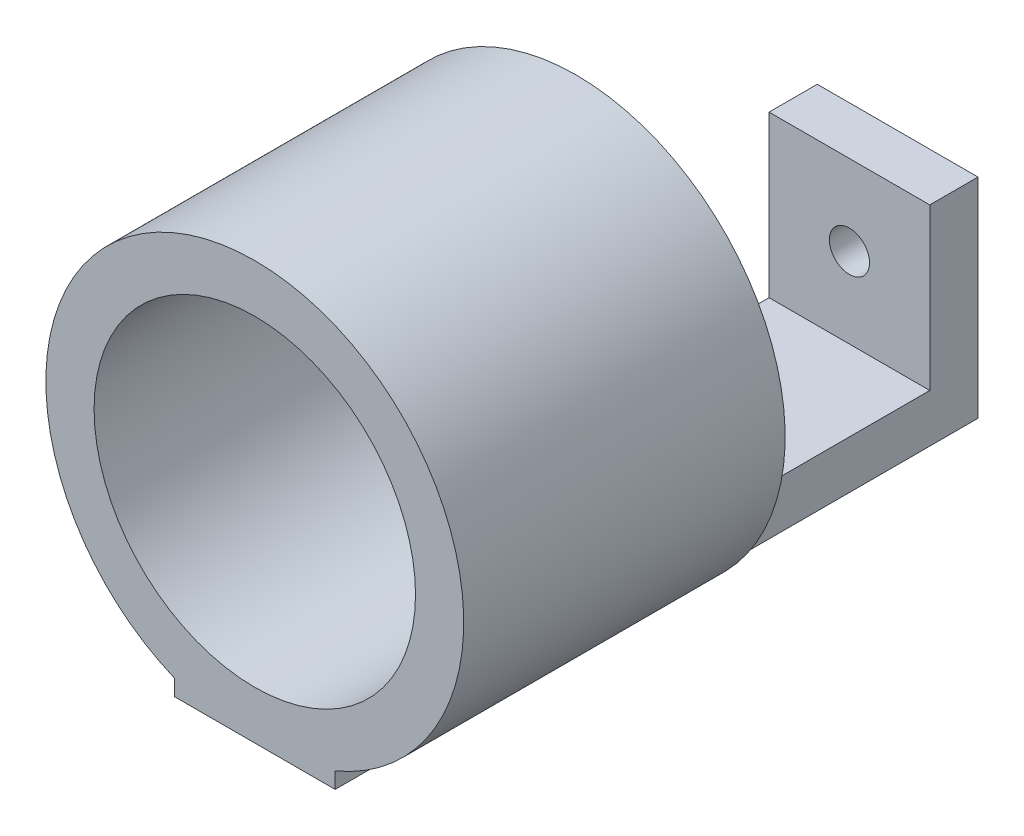
ISO-10303-21;
HEADER;
FILE_DESCRIPTION(('STEP AP214'),'2;1');
FILE_NAME('part.step','',(''),(''),'','','');
FILE_SCHEMA(('AUTOMOTIVE_DESIGN { 1 0 10303 214 1 1 1 1 }'));
ENDSEC;
DATA;
#1=APPLICATION_CONTEXT('core data for automotive mechanical design processes');
#2=APPLICATION_PROTOCOL_DEFINITION('international standard','automotive_design',2000,#1);
#3=PRODUCT_CONTEXT('',#1,'mechanical');
#4=PRODUCT('Part','Part','',(#3));
#5=PRODUCT_RELATED_PRODUCT_CATEGORY('part','',(#4));
#6=PRODUCT_DEFINITION_FORMATION('','',#4);
#7=PRODUCT_DEFINITION_CONTEXT('part definition',#1,'design');
#8=PRODUCT_DEFINITION('design','',#6,#7);
#9=PRODUCT_DEFINITION_SHAPE('','',#8);
#10=(LENGTH_UNIT() NAMED_UNIT(*) SI_UNIT(.MILLI.,.METRE.));
#11=(NAMED_UNIT(*) PLANE_ANGLE_UNIT() SI_UNIT($,.RADIAN.));
#12=(NAMED_UNIT(*) SI_UNIT($,.STERADIAN.) SOLID_ANGLE_UNIT());
#13=UNCERTAINTY_MEASURE_WITH_UNIT(LENGTH_MEASURE(1.E-05),#10,'distance_accuracy_value','');
#14=(GEOMETRIC_REPRESENTATION_CONTEXT(3) GLOBAL_UNCERTAINTY_ASSIGNED_CONTEXT((#13)) GLOBAL_UNIT_ASSIGNED_CONTEXT((#10,
#11,#12)) REPRESENTATION_CONTEXT('',''));
#15=CARTESIAN_POINT('',(0.,0.,0.));
#16=DIRECTION('',(0.,0.,1.));
#17=DIRECTION('',(1.,0.,0.));
#18=AXIS2_PLACEMENT_3D('',#15,#16,#17);
#19=CARTESIAN_POINT('',(0.,3.81,0.));
#20=DIRECTION('',(0.,-1.,0.));
#21=DIRECTION('',(0.,0.,-1.));
#22=AXIS2_PLACEMENT_3D('',#19,#20,#21);
#23=PLANE('',#22);
#24=DIRECTION('',(0.,0.,-1.));
#25=VECTOR('',#24,1.);
#26=CARTESIAN_POINT('',(12.7,3.81,0.));
#27=LINE('',#26,#25);
#28=CARTESIAN_POINT('',(12.7,3.81,-25.4));
#29=VERTEX_POINT('',#28);
#30=CARTESIAN_POINT('',(12.7,3.81,-46.99));
#31=VERTEX_POINT('',#30);
#32=EDGE_CURVE('E75',#29,#31,#27,.T.);
#33=ORIENTED_EDGE('',*,*,#32,.T.);
#34=DIRECTION('',(-1.,0.,0.));
#35=VECTOR('',#34,1.);
#36=CARTESIAN_POINT('',(12.7,3.81,-46.99));
#37=LINE('',#36,#35);
#38=CARTESIAN_POINT('',(0.,3.81,-46.99));
#39=VERTEX_POINT('',#38);
#40=EDGE_CURVE('E70',#31,#39,#37,.T.);
#41=ORIENTED_EDGE('',*,*,#40,.T.);
#42=DIRECTION('',(0.,0.,1.));
#43=VECTOR('',#42,1.);
#44=CARTESIAN_POINT('',(0.,3.81,0.));
#45=LINE('',#44,#43);
#46=CARTESIAN_POINT('',(0.,3.81,-25.4));
#47=VERTEX_POINT('',#46);
#48=EDGE_CURVE('E187',#39,#47,#45,.T.);
#49=ORIENTED_EDGE('',*,*,#48,.T.);
#50=DIRECTION('',(-1.,0.,0.));
#51=VECTOR('',#50,1.);
#52=CARTESIAN_POINT('',(0.,3.81,-25.4));
#53=LINE('',#52,#51);
#54=CARTESIAN_POINT('',(6.35,3.81,-25.4));
#55=VERTEX_POINT('',#54);
#56=EDGE_CURVE('E164',#55,#47,#53,.T.);
#57=ORIENTED_EDGE('',*,*,#56,.F.);
#58=EDGE_CURVE('E171',#29,#55,#53,.T.);
#59=ORIENTED_EDGE('',*,*,#58,.F.);
#60=EDGE_LOOP('',(#33,#41,#49,#57,#59));
#61=FACE_BOUND('',#60,.T.);
#62=ADVANCED_FACE('F54',(#61),#23,.F.);
#63=CARTESIAN_POINT('',(0.,3.81,0.));
#64=DIRECTION('',(1.,0.,0.));
#65=DIRECTION('',(0.,0.,-1.));
#66=AXIS2_PLACEMENT_3D('',#63,#64,#65);
#67=PLANE('',#66);
#68=DIRECTION('',(0.,-1.,0.));
#69=VECTOR('',#68,1.);
#70=CARTESIAN_POINT('',(0.,3.81,0.));
#71=LINE('',#70,#69);
#72=CARTESIAN_POINT('',(0.,1.27000000000001,0.));
#73=VERTEX_POINT('',#72);
#74=CARTESIAN_POINT('',(0.,0.,0.));
#75=VERTEX_POINT('',#74);
#76=EDGE_CURVE('E12',#73,#75,#71,.T.);
#77=ORIENTED_EDGE('',*,*,#76,.F.);
#78=DIRECTION('',(0.,0.,1.));
#79=VECTOR('',#78,1.);
#80=CARTESIAN_POINT('',(0.,1.27000000000001,-25.4));
#81=LINE('',#80,#79);
#82=CARTESIAN_POINT('',(0.,1.27,-25.4));
#83=VERTEX_POINT('',#82);
#84=EDGE_CURVE('E183',#73,#83,#81,.F.);
#85=ORIENTED_EDGE('',*,*,#84,.T.);
#86=DIRECTION('',(0.,-1.,0.));
#87=VECTOR('',#86,1.);
#88=CARTESIAN_POINT('',(0.,3.81,-25.4));
#89=LINE('',#88,#87);
#90=EDGE_CURVE('E176',#47,#83,#89,.T.);
#91=ORIENTED_EDGE('',*,*,#90,.F.);
#92=ORIENTED_EDGE('',*,*,#48,.F.);
#93=DIRECTION('',(0.,1.,0.));
#94=VECTOR('',#93,1.);
#95=CARTESIAN_POINT('',(0.,3.81,-46.99));
#96=LINE('',#95,#94);
#97=CARTESIAN_POINT('',(0.,16.51,-46.99));
#98=VERTEX_POINT('',#97);
#99=EDGE_CURVE('E133',#39,#98,#96,.T.);
#100=ORIENTED_EDGE('',*,*,#99,.T.);
#101=DIRECTION('',(0.,0.,-1.));
#102=VECTOR('',#101,1.);
#103=CARTESIAN_POINT('',(0.,16.51,-46.99));
#104=LINE('',#103,#102);
#105=CARTESIAN_POINT('',(0.,16.51,-50.8));
#106=VERTEX_POINT('',#105);
#107=EDGE_CURVE('E128',#98,#106,#104,.T.);
#108=ORIENTED_EDGE('',*,*,#107,.T.);
#109=DIRECTION('',(0.,-1.,0.));
#110=VECTOR('',#109,1.);
#111=CARTESIAN_POINT('',(0.,3.81,-50.8));
#112=LINE('',#111,#110);
#113=CARTESIAN_POINT('',(0.,0.,-50.8));
#114=VERTEX_POINT('',#113);
#115=EDGE_CURVE('E193',#106,#114,#112,.T.);
#116=ORIENTED_EDGE('',*,*,#115,.T.);
#117=DIRECTION('',(0.,0.,1.));
#118=VECTOR('',#117,1.);
#119=CARTESIAN_POINT('',(0.,0.,0.));
#120=LINE('',#119,#118);
#121=EDGE_CURVE('E186',#114,#75,#120,.T.);
#122=ORIENTED_EDGE('',*,*,#121,.T.);
#123=EDGE_LOOP('',(#77,#85,#91,#92,#100,#108,#116,#122));
#124=FACE_BOUND('',#123,.T.);
#125=ADVANCED_FACE('F56',(#124),#67,.F.);
#126=CARTESIAN_POINT('',(0.,3.81,0.));
#127=DIRECTION('',(0.,0.,-1.));
#128=DIRECTION('',(-1.,0.,0.));
#129=AXIS2_PLACEMENT_3D('',#126,#127,#128);
#130=PLANE('',#129);
#131=CARTESIAN_POINT('',(6.35,16.51,0.));
#132=DIRECTION('',(0.,0.,1.));
#133=DIRECTION('',(1.,0.,0.));
#134=AXIS2_PLACEMENT_3D('',#131,#132,#133);
#135=CIRCLE('',#134,16.51);
#136=CARTESIAN_POINT('',(12.7,1.27,0.));
#137=VERTEX_POINT('',#136);
#138=EDGE_CURVE('E158',#137,#73,#135,.T.);
#139=ORIENTED_EDGE('',*,*,#138,.T.);
#140=ORIENTED_EDGE('',*,*,#76,.T.);
#141=DIRECTION('',(1.,0.,0.));
#142=VECTOR('',#141,1.);
#143=CARTESIAN_POINT('',(0.,0.,0.));
#144=LINE('',#143,#142);
#145=CARTESIAN_POINT('',(12.7,0.,0.));
#146=VERTEX_POINT('',#145);
#147=EDGE_CURVE('E197',#75,#146,#144,.T.);
#148=ORIENTED_EDGE('',*,*,#147,.T.);
#149=DIRECTION('',(0.,-1.,0.));
#150=VECTOR('',#149,1.);
#151=CARTESIAN_POINT('',(12.7,3.81,0.));
#152=LINE('',#151,#150);
#153=EDGE_CURVE('E63',#137,#146,#152,.T.);
#154=ORIENTED_EDGE('',*,*,#153,.F.);
#155=EDGE_LOOP('',(#139,#140,#148,#154));
#156=FACE_BOUND('',#155,.T.);
#157=CARTESIAN_POINT('',(6.35,16.51,0.));
#158=DIRECTION('',(0.,0.,1.));
#159=DIRECTION('',(1.,0.,0.));
#160=AXIS2_PLACEMENT_3D('',#157,#158,#159);
#161=CIRCLE('',#160,12.7);
#162=CARTESIAN_POINT('',(19.05,16.51,0.));
#163=VERTEX_POINT('',#162);
#164=EDGE_CURVE('E146',#163,#163,#161,.T.);
#165=ORIENTED_EDGE('',*,*,#164,.F.);
#166=EDGE_LOOP('',(#165));
#167=FACE_BOUND('',#166,.T.);
#168=ADVANCED_FACE('F249',(#156,#167),#130,.F.);
#169=CARTESIAN_POINT('',(12.7,3.81,0.));
#170=DIRECTION('',(-1.,0.,0.));
#171=DIRECTION('',(0.,0.,1.));
#172=AXIS2_PLACEMENT_3D('',#169,#170,#171);
#173=PLANE('',#172);
#174=DIRECTION('',(0.,1.,0.));
#175=VECTOR('',#174,1.);
#176=CARTESIAN_POINT('',(12.7,3.81,-25.4));
#177=LINE('',#176,#175);
#178=CARTESIAN_POINT('',(12.7,1.27,-25.4));
#179=VERTEX_POINT('',#178);
#180=EDGE_CURVE('E172',#179,#29,#177,.T.);
#181=ORIENTED_EDGE('',*,*,#180,.F.);
#182=DIRECTION('',(0.,0.,1.));
#183=VECTOR('',#182,1.);
#184=CARTESIAN_POINT('',(12.7,1.27000000000001,-25.4));
#185=LINE('',#184,#183);
#186=EDGE_CURVE('E180',#179,#137,#185,.T.);
#187=ORIENTED_EDGE('',*,*,#186,.T.);
#188=ORIENTED_EDGE('',*,*,#153,.T.);
#189=DIRECTION('',(0.,0.,-1.));
#190=VECTOR('',#189,1.);
#191=CARTESIAN_POINT('',(12.7,0.,0.));
#192=LINE('',#191,#190);
#193=CARTESIAN_POINT('',(12.7,0.,-50.8));
#194=VERTEX_POINT('',#193);
#195=EDGE_CURVE('E200',#146,#194,#192,.T.);
#196=ORIENTED_EDGE('',*,*,#195,.T.);
#197=DIRECTION('',(0.,-1.,0.));
#198=VECTOR('',#197,1.);
#199=CARTESIAN_POINT('',(12.7,3.81,-50.8));
#200=LINE('',#199,#198);
#201=CARTESIAN_POINT('',(12.7,16.51,-50.8));
#202=VERTEX_POINT('',#201);
#203=EDGE_CURVE('E143',#202,#194,#200,.T.);
#204=ORIENTED_EDGE('',*,*,#203,.F.);
#205=DIRECTION('',(0.,0.,-1.));
#206=VECTOR('',#205,1.);
#207=CARTESIAN_POINT('',(12.7,16.51,-46.99));
#208=LINE('',#207,#206);
#209=CARTESIAN_POINT('',(12.7,16.51,-46.99));
#210=VERTEX_POINT('',#209);
#211=EDGE_CURVE('E126',#210,#202,#208,.T.);
#212=ORIENTED_EDGE('',*,*,#211,.F.);
#213=DIRECTION('',(0.,1.,0.));
#214=VECTOR('',#213,1.);
#215=CARTESIAN_POINT('',(12.7,3.81,-46.99));
#216=LINE('',#215,#214);
#217=EDGE_CURVE('E134',#31,#210,#216,.T.);
#218=ORIENTED_EDGE('',*,*,#217,.F.);
#219=ORIENTED_EDGE('',*,*,#32,.F.);
#220=EDGE_LOOP('',(#181,#187,#188,#196,#204,#212,#218,#219));
#221=FACE_BOUND('',#220,.T.);
#222=ADVANCED_FACE('F141',(#221),#173,.F.);
#223=CARTESIAN_POINT('',(0.,3.81,-50.8));
#224=DIRECTION('',(0.,0.,1.));
#225=DIRECTION('',(1.,0.,0.));
#226=AXIS2_PLACEMENT_3D('',#223,#224,#225);
#227=PLANE('',#226);
#228=DIRECTION('',(-1.,0.,0.));
#229=VECTOR('',#228,1.);
#230=CARTESIAN_POINT('',(0.,0.,-50.8));
#231=LINE('',#230,#229);
#232=EDGE_CURVE('E190',#194,#114,#231,.T.);
#233=ORIENTED_EDGE('',*,*,#232,.T.);
#234=ORIENTED_EDGE('',*,*,#115,.F.);
#235=DIRECTION('',(-1.,0.,0.));
#236=VECTOR('',#235,1.);
#237=CARTESIAN_POINT('',(12.7,16.51,-50.8));
#238=LINE('',#237,#236);
#239=EDGE_CURVE('E139',#202,#106,#238,.T.);
#240=ORIENTED_EDGE('',*,*,#239,.F.);
#241=ORIENTED_EDGE('',*,*,#203,.T.);
#242=EDGE_LOOP('',(#233,#234,#240,#241));
#243=FACE_BOUND('',#242,.T.);
#244=CARTESIAN_POINT('',(6.35,10.16,-50.8));
#245=DIRECTION('',(0.,0.,-1.));
#246=DIRECTION('',(-1.,0.,0.));
#247=AXIS2_PLACEMENT_3D('',#244,#245,#246);
#248=CIRCLE('',#247,1.5875);
#249=CARTESIAN_POINT('',(4.7625,10.16,-50.8));
#250=VERTEX_POINT('',#249);
#251=EDGE_CURVE('E229',#250,#250,#248,.T.);
#252=ORIENTED_EDGE('',*,*,#251,.F.);
#253=EDGE_LOOP('',(#252));
#254=FACE_BOUND('',#253,.T.);
#255=ADVANCED_FACE('F222',(#243,#254),#227,.F.);
#256=CARTESIAN_POINT('',(0.,0.,0.));
#257=DIRECTION('',(0.,-1.,0.));
#258=DIRECTION('',(0.,0.,-1.));
#259=AXIS2_PLACEMENT_3D('',#256,#257,#258);
#260=PLANE('',#259);
#261=ORIENTED_EDGE('',*,*,#195,.F.);
#262=ORIENTED_EDGE('',*,*,#147,.F.);
#263=ORIENTED_EDGE('',*,*,#121,.F.);
#264=ORIENTED_EDGE('',*,*,#232,.F.);
#265=EDGE_LOOP('',(#261,#262,#263,#264));
#266=FACE_BOUND('',#265,.T.);
#267=ADVANCED_FACE('F219',(#266),#260,.T.);
#268=CARTESIAN_POINT('',(6.35,16.51,-25.4));
#269=DIRECTION('',(0.,0.,1.));
#270=DIRECTION('',(1.,0.,0.));
#271=AXIS2_PLACEMENT_3D('',#268,#269,#270);
#272=CYLINDRICAL_SURFACE('',#271,16.51);
#273=ORIENTED_EDGE('',*,*,#84,.F.);
#274=ORIENTED_EDGE('',*,*,#138,.F.);
#275=ORIENTED_EDGE('',*,*,#186,.F.);
#276=CARTESIAN_POINT('',(6.35,16.51,-25.4));
#277=DIRECTION('',(0.,0.,1.));
#278=DIRECTION('',(1.,0.,0.));
#279=AXIS2_PLACEMENT_3D('',#276,#277,#278);
#280=CIRCLE('',#279,16.51);
#281=EDGE_CURVE('E160',#179,#83,#280,.T.);
#282=ORIENTED_EDGE('',*,*,#281,.T.);
#283=EDGE_LOOP('',(#273,#274,#275,#282));
#284=FACE_BOUND('',#283,.T.);
#285=ADVANCED_FACE('F247',(#284),#272,.T.);
#286=CARTESIAN_POINT('',(6.35,16.51,-25.4));
#287=DIRECTION('',(0.,0.,1.));
#288=DIRECTION('',(1.,0.,0.));
#289=AXIS2_PLACEMENT_3D('',#286,#287,#288);
#290=PLANE('',#289);
#291=ORIENTED_EDGE('',*,*,#56,.T.);
#292=ORIENTED_EDGE('',*,*,#90,.T.);
#293=ORIENTED_EDGE('',*,*,#281,.F.);
#294=ORIENTED_EDGE('',*,*,#180,.T.);
#295=ORIENTED_EDGE('',*,*,#58,.T.);
#296=CARTESIAN_POINT('',(6.35,16.51,-25.4));
#297=DIRECTION('',(0.,0.,1.));
#298=DIRECTION('',(1.,0.,0.));
#299=AXIS2_PLACEMENT_3D('',#296,#297,#298);
#300=CIRCLE('',#299,12.7);
#301=EDGE_CURVE('E151',#55,#55,#300,.T.);
#302=ORIENTED_EDGE('',*,*,#301,.T.);
#303=EDGE_LOOP('',(#291,#292,#293,#294,#295,#302));
#304=FACE_BOUND('',#303,.T.);
#305=ADVANCED_FACE('F259',(#304),#290,.F.);
#306=CARTESIAN_POINT('',(6.35,16.51,-25.4));
#307=DIRECTION('',(0.,0.,1.));
#308=DIRECTION('',(1.,0.,0.));
#309=AXIS2_PLACEMENT_3D('',#306,#307,#308);
#310=CYLINDRICAL_SURFACE('',#309,12.7);
#311=ORIENTED_EDGE('',*,*,#164,.T.);
#312=EDGE_LOOP('',(#311));
#313=FACE_BOUND('',#312,.T.);
#314=ORIENTED_EDGE('',*,*,#301,.F.);
#315=EDGE_LOOP('',(#314));
#316=FACE_BOUND('',#315,.T.);
#317=ADVANCED_FACE('F263',(#313,#316),#310,.F.);
#318=CARTESIAN_POINT('',(12.7,16.51,-46.99));
#319=DIRECTION('',(0.,-1.,0.));
#320=DIRECTION('',(0.,0.,-1.));
#321=AXIS2_PLACEMENT_3D('',#318,#319,#320);
#322=PLANE('',#321);
#323=ORIENTED_EDGE('',*,*,#239,.T.);
#324=ORIENTED_EDGE('',*,*,#107,.F.);
#325=DIRECTION('',(-1.,0.,0.));
#326=VECTOR('',#325,1.);
#327=CARTESIAN_POINT('',(12.7,16.51,-46.99));
#328=LINE('',#327,#326);
#329=EDGE_CURVE('E121',#210,#98,#328,.T.);
#330=ORIENTED_EDGE('',*,*,#329,.F.);
#331=ORIENTED_EDGE('',*,*,#211,.T.);
#332=EDGE_LOOP('',(#323,#324,#330,#331));
#333=FACE_BOUND('',#332,.T.);
#334=ADVANCED_FACE('F124',(#333),#322,.F.);
#335=CARTESIAN_POINT('',(0.,0.,-46.99));
#336=DIRECTION('',(0.,0.,1.));
#337=DIRECTION('',(1.,0.,0.));
#338=AXIS2_PLACEMENT_3D('',#335,#336,#337);
#339=PLANE('',#338);
#340=CARTESIAN_POINT('',(6.35,10.16,-46.99));
#341=DIRECTION('',(0.,0.,-1.));
#342=DIRECTION('',(-1.,0.,0.));
#343=AXIS2_PLACEMENT_3D('',#340,#341,#342);
#344=CIRCLE('',#343,1.5875);
#345=CARTESIAN_POINT('',(4.7625,10.16,-46.99));
#346=VERTEX_POINT('',#345);
#347=EDGE_CURVE('E226',#346,#346,#344,.T.);
#348=ORIENTED_EDGE('',*,*,#347,.T.);
#349=EDGE_LOOP('',(#348));
#350=FACE_BOUND('',#349,.T.);
#351=ORIENTED_EDGE('',*,*,#217,.T.);
#352=ORIENTED_EDGE('',*,*,#329,.T.);
#353=ORIENTED_EDGE('',*,*,#99,.F.);
#354=ORIENTED_EDGE('',*,*,#40,.F.);
#355=EDGE_LOOP('',(#351,#352,#353,#354));
#356=FACE_BOUND('',#355,.T.);
#357=ADVANCED_FACE('F136',(#350,#356),#339,.T.);
#358=CARTESIAN_POINT('',(6.35,10.16,-46.99));
#359=DIRECTION('',(0.,0.,-1.));
#360=DIRECTION('',(-1.,0.,0.));
#361=AXIS2_PLACEMENT_3D('',#358,#359,#360);
#362=CYLINDRICAL_SURFACE('',#361,1.5875);
#363=CARTESIAN_POINT('',(4.7625,10.16,-46.99));
#364=CARTESIAN_POINT('',(4.7625,10.16,-47.0296875));
#365=CARTESIAN_POINT('',(4.7625,10.16,-47.069375));
#366=CARTESIAN_POINT('',(4.7625,10.16,-47.14875));
#367=CARTESIAN_POINT('',(4.7625,10.16,-47.1884375));
#368=CARTESIAN_POINT('',(4.7625,10.16,-47.2678125));
#369=CARTESIAN_POINT('',(4.7625,10.16,-47.3075));
#370=CARTESIAN_POINT('',(4.7625,10.16,-47.386875));
#371=CARTESIAN_POINT('',(4.7625,10.16,-47.4265625));
#372=CARTESIAN_POINT('',(4.7625,10.16,-47.5059375));
#373=CARTESIAN_POINT('',(4.7625,10.16,-47.545625));
#374=CARTESIAN_POINT('',(4.7625,10.16,-47.625));
#375=CARTESIAN_POINT('',(4.7625,10.16,-47.6646875));
#376=CARTESIAN_POINT('',(4.7625,10.16,-47.7440625));
#377=CARTESIAN_POINT('',(4.7625,10.16,-47.78375));
#378=CARTESIAN_POINT('',(4.7625,10.16,-47.863125));
#379=CARTESIAN_POINT('',(4.7625,10.16,-47.9028125));
#380=CARTESIAN_POINT('',(4.7625,10.16,-47.9821875));
#381=CARTESIAN_POINT('',(4.7625,10.16,-48.021875));
#382=CARTESIAN_POINT('',(4.7625,10.16,-48.10125));
#383=CARTESIAN_POINT('',(4.7625,10.16,-48.1409375));
#384=CARTESIAN_POINT('',(4.7625,10.16,-48.2203125));
#385=CARTESIAN_POINT('',(4.7625,10.16,-48.26));
#386=CARTESIAN_POINT('',(4.7625,10.16,-48.339375));
#387=CARTESIAN_POINT('',(4.7625,10.16,-48.3790625));
#388=CARTESIAN_POINT('',(4.7625,10.16,-48.4584375));
#389=CARTESIAN_POINT('',(4.7625,10.16,-48.498125));
#390=CARTESIAN_POINT('',(4.7625,10.16,-48.5775));
#391=CARTESIAN_POINT('',(4.7625,10.16,-48.6171875));
#392=CARTESIAN_POINT('',(4.7625,10.16,-48.6965625));
#393=CARTESIAN_POINT('',(4.7625,10.16,-48.73625));
#394=CARTESIAN_POINT('',(4.7625,10.16,-48.815625));
#395=CARTESIAN_POINT('',(4.7625,10.16,-48.8553125));
#396=CARTESIAN_POINT('',(4.7625,10.16,-48.9346875));
#397=CARTESIAN_POINT('',(4.7625,10.16,-48.974375));
#398=CARTESIAN_POINT('',(4.7625,10.16,-49.05375));
#399=CARTESIAN_POINT('',(4.7625,10.16,-49.0934375));
#400=CARTESIAN_POINT('',(4.7625,10.16,-49.1728125));
#401=CARTESIAN_POINT('',(4.7625,10.16,-49.2125));
#402=CARTESIAN_POINT('',(4.7625,10.16,-49.291875));
#403=CARTESIAN_POINT('',(4.7625,10.16,-49.3315625));
#404=CARTESIAN_POINT('',(4.7625,10.16,-49.4109375));
#405=CARTESIAN_POINT('',(4.7625,10.16,-49.450625));
#406=CARTESIAN_POINT('',(4.7625,10.16,-49.53));
#407=CARTESIAN_POINT('',(4.7625,10.16,-49.5696875));
#408=CARTESIAN_POINT('',(4.7625,10.16,-49.6490625));
#409=CARTESIAN_POINT('',(4.7625,10.16,-49.68875));
#410=CARTESIAN_POINT('',(4.7625,10.16,-49.768125));
#411=CARTESIAN_POINT('',(4.7625,10.16,-49.8078125));
#412=CARTESIAN_POINT('',(4.7625,10.16,-49.8871875));
#413=CARTESIAN_POINT('',(4.7625,10.16,-49.926875));
#414=CARTESIAN_POINT('',(4.7625,10.16,-50.00625));
#415=CARTESIAN_POINT('',(4.7625,10.16,-50.0459375));
#416=CARTESIAN_POINT('',(4.7625,10.16,-50.1253125));
#417=CARTESIAN_POINT('',(4.7625,10.16,-50.165));
#418=CARTESIAN_POINT('',(4.7625,10.16,-50.244375));
#419=CARTESIAN_POINT('',(4.7625,10.16,-50.2840625));
#420=CARTESIAN_POINT('',(4.7625,10.16,-50.3634375));
#421=CARTESIAN_POINT('',(4.7625,10.16,-50.403125));
#422=CARTESIAN_POINT('',(4.7625,10.16,-50.4825));
#423=CARTESIAN_POINT('',(4.7625,10.16,-50.5221875));
#424=CARTESIAN_POINT('',(4.7625,10.16,-50.6015625));
#425=CARTESIAN_POINT('',(4.7625,10.16,-50.64125));
#426=CARTESIAN_POINT('',(4.7625,10.16,-50.720625));
#427=CARTESIAN_POINT('',(4.7625,10.16,-50.7603125));
#428=CARTESIAN_POINT('',(4.7625,10.16,-50.8));
#429=B_SPLINE_CURVE_WITH_KNOTS('',3,(#363,#364,#365,#366,#367,#368,#369,#370,#371,#372,#373,
#374,#375,#376,#377,#378,#379,#380,#381,#382,#383,#384,#385,#386,#387,#388,#389,#390,#391,#392,
#393,#394,#395,#396,#397,#398,#399,#400,#401,#402,#403,#404,#405,#406,#407,#408,#409,#410,#411,
#412,#413,#414,#415,#416,#417,#418,#419,#420,#421,#422,#423,#424,#425,#426,#427,#428),
.UNSPECIFIED.,.F.,.F.,(4,2,2,2,2,2,2,2,2,2,2,2,2,2,2,2,2,2,2,2,2,2,2,2,2,2,2,2,2,2,2,2,4),(0.,
0.119062500000003,0.238125000000006,0.357187500000002,0.476250000000004,0.5953125,
0.714375000000003,0.833437500000006,0.952500000000002,1.0715625,1.190625,1.3096875,
1.42875000000001,1.5478125,1.66687500000001,1.7859375,1.905,2.02406250000001,2.143125,
2.26218750000001,2.38125,2.5003125,2.61937500000001,2.7384375,2.85750000000001,2.9765625,
3.095625,3.2146875,3.33375,3.45281250000001,3.571875,3.6909375,3.81),.UNSPECIFIED.);
#430=EDGE_CURVE('BSEAM240',#346,#250,#429,.T.);
#431=ORIENTED_EDGE('',*,*,#347,.F.);
#432=ORIENTED_EDGE('',*,*,#251,.T.);
#433=ORIENTED_EDGE('',*,*,#430,.T.);
#434=ORIENTED_EDGE('',*,*,#430,.F.);
#435=EDGE_LOOP('',(#431,#433,#432,#434));
#436=FACE_BOUND('',#435,.T.);
#437=ADVANCED_FACE('F240',(#436),#362,.F.);
#438=CLOSED_SHELL('',(#62,#125,#168,#222,#255,#267,#285,#305,#317,#334,#357,#437));
#439=MANIFOLD_SOLID_BREP('B2',#438);
#440=ADVANCED_BREP_SHAPE_REPRESENTATION('',(#18,#439),#14);
#441=SHAPE_DEFINITION_REPRESENTATION(#9,#440);
ENDSEC;
END-ISO-10303-21;
